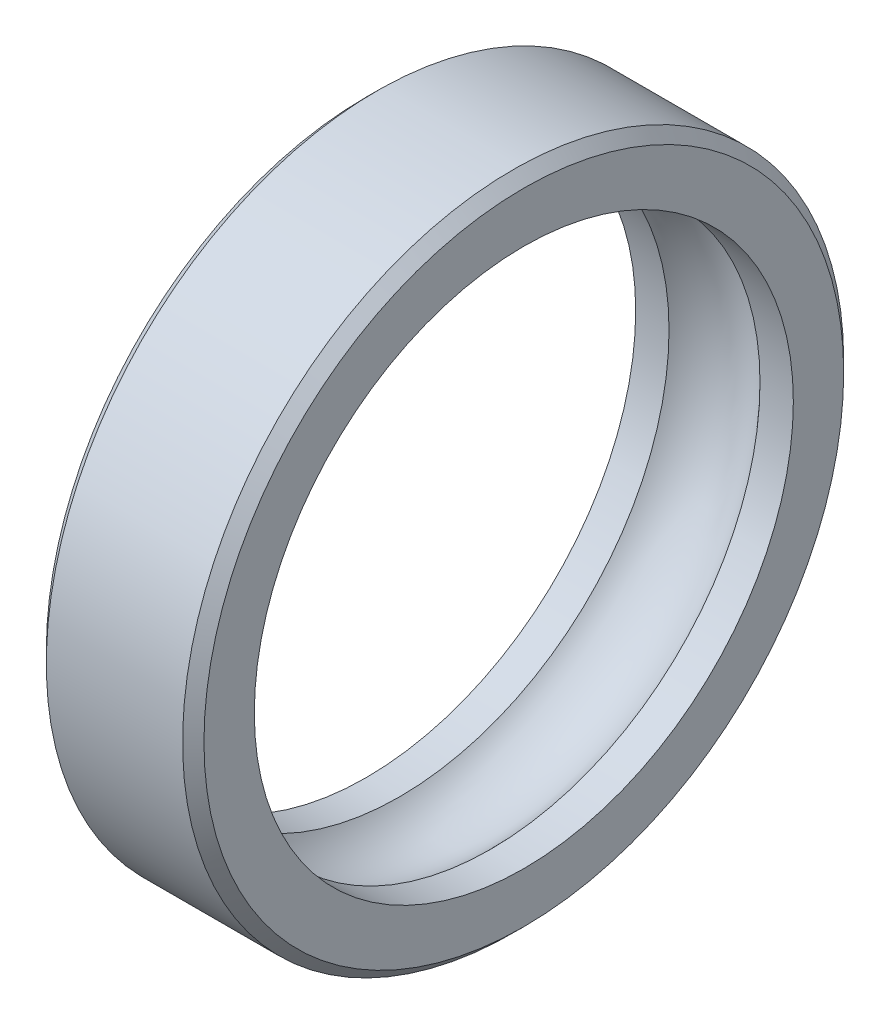
ISO-10303-21;
HEADER;
FILE_DESCRIPTION(('STEP AP214'),'2;1');
FILE_NAME('part.step','',(''),(''),'','','');
FILE_SCHEMA(('AUTOMOTIVE_DESIGN { 1 0 10303 214 1 1 1 1 }'));
ENDSEC;
DATA;
#1=APPLICATION_CONTEXT('core data for automotive mechanical design processes');
#2=APPLICATION_PROTOCOL_DEFINITION('international standard','automotive_design',2000,#1);
#3=PRODUCT_CONTEXT('',#1,'mechanical');
#4=PRODUCT('Part','Part','',(#3));
#5=PRODUCT_RELATED_PRODUCT_CATEGORY('part','',(#4));
#6=PRODUCT_DEFINITION_FORMATION('','',#4);
#7=PRODUCT_DEFINITION_CONTEXT('part definition',#1,'design');
#8=PRODUCT_DEFINITION('design','',#6,#7);
#9=PRODUCT_DEFINITION_SHAPE('','',#8);
#10=(LENGTH_UNIT() NAMED_UNIT(*) SI_UNIT(.MILLI.,.METRE.));
#11=(NAMED_UNIT(*) PLANE_ANGLE_UNIT() SI_UNIT($,.RADIAN.));
#12=(NAMED_UNIT(*) SI_UNIT($,.STERADIAN.) SOLID_ANGLE_UNIT());
#13=UNCERTAINTY_MEASURE_WITH_UNIT(LENGTH_MEASURE(1.E-05),#10,'distance_accuracy_value','');
#14=(GEOMETRIC_REPRESENTATION_CONTEXT(3) GLOBAL_UNCERTAINTY_ASSIGNED_CONTEXT((#13)) GLOBAL_UNIT_ASSIGNED_CONTEXT((#10,
#11,#12)) REPRESENTATION_CONTEXT('',''));
#15=CARTESIAN_POINT('',(0.,0.,0.));
#16=DIRECTION('',(0.,0.,1.));
#17=DIRECTION('',(1.,0.,0.));
#18=AXIS2_PLACEMENT_3D('',#15,#16,#17);
#19=CARTESIAN_POINT('',(-76.6332355813113,0.,0.));
#20=DIRECTION('',(-1.,0.,0.));
#21=DIRECTION('',(0.,0.,1.));
#22=AXIS2_PLACEMENT_3D('',#19,#20,#21);
#23=CYLINDRICAL_SURFACE('',#22,65.);
#24=CARTESIAN_POINT('',(-13.4,0.,0.));
#25=DIRECTION('',(1.,0.,0.));
#26=DIRECTION('',(0.,0.,-1.));
#27=AXIS2_PLACEMENT_3D('',#24,#25,#26);
#28=CIRCLE('',#27,65.);
#29=CARTESIAN_POINT('',(-13.4,0.,-65.));
#30=VERTEX_POINT('',#29);
#31=EDGE_CURVE('E48',#30,#30,#28,.T.);
#32=ORIENTED_EDGE('',*,*,#31,.T.);
#33=EDGE_LOOP('',(#32));
#34=FACE_BOUND('',#33,.T.);
#35=CARTESIAN_POINT('',(13.4,0.,0.));
#36=DIRECTION('',(1.,0.,0.));
#37=DIRECTION('',(0.,0.,-1.));
#38=AXIS2_PLACEMENT_3D('',#35,#36,#37);
#39=CIRCLE('',#38,65.);
#40=CARTESIAN_POINT('',(13.4,0.,-65.));
#41=VERTEX_POINT('',#40);
#42=EDGE_CURVE('E53',#41,#41,#39,.F.);
#43=ORIENTED_EDGE('',*,*,#42,.T.);
#44=EDGE_LOOP('',(#43));
#45=FACE_BOUND('',#44,.T.);
#46=ADVANCED_FACE('F39',(#34,#45),#23,.T.);
#47=CARTESIAN_POINT('',(-15.5,65.,0.));
#48=DIRECTION('',(1.,0.,0.));
#49=DIRECTION('',(0.,0.,-1.));
#50=AXIS2_PLACEMENT_3D('',#47,#48,#49);
#51=PLANE('',#50);
#52=CARTESIAN_POINT('',(-15.5,0.,0.));
#53=DIRECTION('',(1.,0.,0.));
#54=DIRECTION('',(0.,0.,-1.));
#55=AXIS2_PLACEMENT_3D('',#52,#53,#54);
#56=CIRCLE('',#55,62.9);
#57=CARTESIAN_POINT('',(-15.5,0.,-62.9));
#58=VERTEX_POINT('',#57);
#59=EDGE_CURVE('E58',#58,#58,#56,.F.);
#60=ORIENTED_EDGE('',*,*,#59,.T.);
#61=EDGE_LOOP('',(#60));
#62=FACE_BOUND('',#61,.T.);
#63=CARTESIAN_POINT('',(-15.5,0.,0.));
#64=DIRECTION('',(-1.,0.,0.));
#65=DIRECTION('',(0.,0.,1.));
#66=AXIS2_PLACEMENT_3D('',#63,#64,#65);
#67=CIRCLE('',#66,53.);
#68=CARTESIAN_POINT('',(-15.5,0.,53.));
#69=VERTEX_POINT('',#68);
#70=EDGE_CURVE('E64',#69,#69,#67,.T.);
#71=ORIENTED_EDGE('',*,*,#70,.F.);
#72=EDGE_LOOP('',(#71));
#73=FACE_BOUND('',#72,.T.);
#74=ADVANCED_FACE('F98',(#62,#73),#51,.F.);
#75=CARTESIAN_POINT('',(-76.6332355813113,0.,0.));
#76=DIRECTION('',(-1.,0.,0.));
#77=DIRECTION('',(0.,0.,1.));
#78=AXIS2_PLACEMENT_3D('',#75,#76,#77);
#79=CYLINDRICAL_SURFACE('',#78,53.);
#80=ORIENTED_EDGE('',*,*,#70,.T.);
#81=EDGE_LOOP('',(#80));
#82=FACE_BOUND('',#81,.T.);
#83=CARTESIAN_POINT('',(-8.94427190999915,0.,0.));
#84=DIRECTION('',(-1.,0.,0.));
#85=DIRECTION('',(0.,0.,1.));
#86=AXIS2_PLACEMENT_3D('',#83,#84,#85);
#87=CIRCLE('',#86,53.);
#88=CARTESIAN_POINT('',(-8.94427190999915,0.,53.));
#89=VERTEX_POINT('',#88);
#90=EDGE_CURVE('E68',#89,#89,#87,.T.);
#91=ORIENTED_EDGE('',*,*,#90,.F.);
#92=EDGE_LOOP('',(#91));
#93=FACE_BOUND('',#92,.T.);
#94=ADVANCED_FACE('F94',(#82,#93),#79,.F.);
#95=CARTESIAN_POINT('',(0.,0.,0.));
#96=DIRECTION('',(-1.,0.,0.));
#97=DIRECTION('',(0.,0.,1.));
#98=AXIS2_PLACEMENT_3D('',#95,#96,#97);
#99=TOROIDAL_SURFACE('',#98,45.,12.);
#100=ORIENTED_EDGE('',*,*,#90,.T.);
#101=EDGE_LOOP('',(#100));
#102=FACE_BOUND('',#101,.T.);
#103=CARTESIAN_POINT('',(8.94427190999916,0.,0.));
#104=DIRECTION('',(-1.,0.,0.));
#105=DIRECTION('',(0.,0.,1.));
#106=AXIS2_PLACEMENT_3D('',#103,#104,#105);
#107=CIRCLE('',#106,53.);
#108=CARTESIAN_POINT('',(8.94427190999916,0.,53.));
#109=VERTEX_POINT('',#108);
#110=EDGE_CURVE('E72',#109,#109,#107,.T.);
#111=ORIENTED_EDGE('',*,*,#110,.F.);
#112=EDGE_LOOP('',(#111));
#113=FACE_BOUND('',#112,.T.);
#114=ADVANCED_FACE('F85',(#102,#113),#99,.F.);
#115=CARTESIAN_POINT('',(-76.6332355813113,0.,0.));
#116=DIRECTION('',(-1.,0.,0.));
#117=DIRECTION('',(0.,0.,1.));
#118=AXIS2_PLACEMENT_3D('',#115,#116,#117);
#119=CYLINDRICAL_SURFACE('',#118,53.);
#120=ORIENTED_EDGE('',*,*,#110,.T.);
#121=EDGE_LOOP('',(#120));
#122=FACE_BOUND('',#121,.T.);
#123=CARTESIAN_POINT('',(15.5,0.,0.));
#124=DIRECTION('',(-1.,0.,0.));
#125=DIRECTION('',(0.,0.,1.));
#126=AXIS2_PLACEMENT_3D('',#123,#124,#125);
#127=CIRCLE('',#126,53.);
#128=CARTESIAN_POINT('',(15.5,0.,53.));
#129=VERTEX_POINT('',#128);
#130=EDGE_CURVE('E76',#129,#129,#127,.T.);
#131=ORIENTED_EDGE('',*,*,#130,.F.);
#132=EDGE_LOOP('',(#131));
#133=FACE_BOUND('',#132,.T.);
#134=ADVANCED_FACE('F83',(#122,#133),#119,.F.);
#135=CARTESIAN_POINT('',(15.5,65.,0.));
#136=DIRECTION('',(1.,0.,0.));
#137=DIRECTION('',(0.,0.,-1.));
#138=AXIS2_PLACEMENT_3D('',#135,#136,#137);
#139=PLANE('',#138);
#140=CARTESIAN_POINT('',(15.5,0.,0.));
#141=DIRECTION('',(1.,0.,0.));
#142=DIRECTION('',(0.,0.,-1.));
#143=AXIS2_PLACEMENT_3D('',#140,#141,#142);
#144=CIRCLE('',#143,62.9);
#145=CARTESIAN_POINT('',(15.5,0.,-62.9));
#146=VERTEX_POINT('',#145);
#147=EDGE_CURVE('E10',#146,#146,#144,.T.);
#148=ORIENTED_EDGE('',*,*,#147,.T.);
#149=EDGE_LOOP('',(#148));
#150=FACE_BOUND('',#149,.T.);
#151=ORIENTED_EDGE('',*,*,#130,.T.);
#152=EDGE_LOOP('',(#151));
#153=FACE_BOUND('',#152,.T.);
#154=ADVANCED_FACE('F81',(#150,#153),#139,.T.);
#155=CARTESIAN_POINT('',(-15.5,0.,0.));
#156=DIRECTION('',(1.,0.,0.));
#157=DIRECTION('',(0.,0.,-1.));
#158=AXIS2_PLACEMENT_3D('',#155,#156,#157);
#159=CONICAL_SURFACE('',#158,62.9,0.785398163397445);
#160=ORIENTED_EDGE('',*,*,#31,.F.);
#161=EDGE_LOOP('',(#160));
#162=FACE_BOUND('',#161,.T.);
#163=ORIENTED_EDGE('',*,*,#59,.F.);
#164=EDGE_LOOP('',(#163));
#165=FACE_BOUND('',#164,.T.);
#166=ADVANCED_FACE('F92',(#162,#165),#159,.T.);
#167=CARTESIAN_POINT('',(13.4,0.,0.));
#168=DIRECTION('',(-1.,0.,0.));
#169=DIRECTION('',(0.,0.,1.));
#170=AXIS2_PLACEMENT_3D('',#167,#168,#169);
#171=CONICAL_SURFACE('',#170,65.,0.785398163397448);
#172=ORIENTED_EDGE('',*,*,#147,.F.);
#173=EDGE_LOOP('',(#172));
#174=FACE_BOUND('',#173,.T.);
#175=ORIENTED_EDGE('',*,*,#42,.F.);
#176=EDGE_LOOP('',(#175));
#177=FACE_BOUND('',#176,.T.);
#178=ADVANCED_FACE('F42',(#174,#177),#171,.T.);
#179=CLOSED_SHELL('',(#46,#74,#94,#114,#134,#154,#166,#178));
#180=MANIFOLD_SOLID_BREP('B2',#179);
#181=ADVANCED_BREP_SHAPE_REPRESENTATION('',(#18,#180),#14);
#182=SHAPE_DEFINITION_REPRESENTATION(#9,#181);
ENDSEC;
END-ISO-10303-21;
